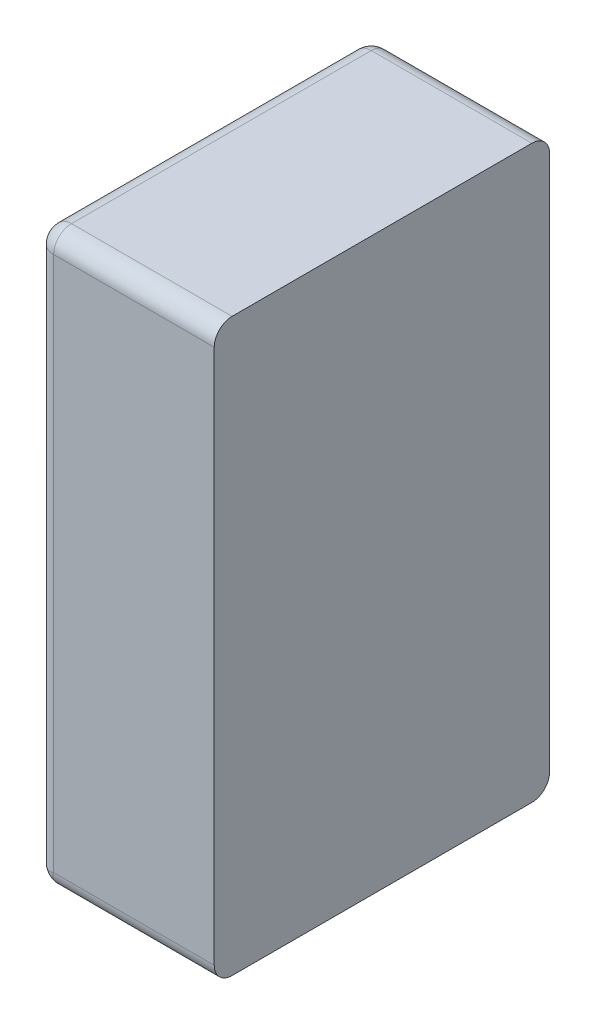
ISO-10303-21;
HEADER;
FILE_DESCRIPTION(('STEP AP214'),'2;1');
FILE_NAME('part.step','',(''),(''),'','','');
FILE_SCHEMA(('AUTOMOTIVE_DESIGN { 1 0 10303 214 1 1 1 1 }'));
ENDSEC;
DATA;
#1=APPLICATION_CONTEXT('core data for automotive mechanical design processes');
#2=APPLICATION_PROTOCOL_DEFINITION('international standard','automotive_design',2000,#1);
#3=PRODUCT_CONTEXT('',#1,'mechanical');
#4=PRODUCT('Part','Part','',(#3));
#5=PRODUCT_RELATED_PRODUCT_CATEGORY('part','',(#4));
#6=PRODUCT_DEFINITION_FORMATION('','',#4);
#7=PRODUCT_DEFINITION_CONTEXT('part definition',#1,'design');
#8=PRODUCT_DEFINITION('design','',#6,#7);
#9=PRODUCT_DEFINITION_SHAPE('','',#8);
#10=(LENGTH_UNIT() NAMED_UNIT(*) SI_UNIT(.MILLI.,.METRE.));
#11=(NAMED_UNIT(*) PLANE_ANGLE_UNIT() SI_UNIT($,.RADIAN.));
#12=(NAMED_UNIT(*) SI_UNIT($,.STERADIAN.) SOLID_ANGLE_UNIT());
#13=UNCERTAINTY_MEASURE_WITH_UNIT(LENGTH_MEASURE(1.E-05),#10,'distance_accuracy_value','');
#14=(GEOMETRIC_REPRESENTATION_CONTEXT(3) GLOBAL_UNCERTAINTY_ASSIGNED_CONTEXT((#13)) GLOBAL_UNIT_ASSIGNED_CONTEXT((#10,
#11,#12)) REPRESENTATION_CONTEXT('',''));
#15=CARTESIAN_POINT('',(0.,0.,0.));
#16=DIRECTION('',(0.,0.,1.));
#17=DIRECTION('',(1.,0.,0.));
#18=AXIS2_PLACEMENT_3D('',#15,#16,#17);
#19=CARTESIAN_POINT('',(-1.55,0.75,0.05));
#20=DIRECTION('',(-0.816496580927727,-0.408248290463863,0.408248290463862));
#21=DIRECTION('',(-0.577350269189625,0.577350269189627,-0.577350269189626));
#22=AXIS2_PLACEMENT_3D('',#19,#20,#21);
#23=SPHERICAL_SURFACE('',#22,0.05);
#24=CARTESIAN_POINT('',(-1.55,0.75,0.05));
#25=DIRECTION('',(0.,0.,-1.));
#26=DIRECTION('',(0.,1.,0.));
#27=AXIS2_PLACEMENT_3D('',#24,#25,#26);
#28=CIRCLE('',#27,0.05);
#29=CARTESIAN_POINT('',(-1.6,0.75,0.05));
#30=VERTEX_POINT('',#29);
#31=CARTESIAN_POINT('',(-1.55,0.8,0.05));
#32=VERTEX_POINT('',#31);
#33=EDGE_CURVE('E11',#30,#32,#28,.T.);
#34=ORIENTED_EDGE('',*,*,#33,.T.);
#35=CARTESIAN_POINT('',(-1.55,0.75,0.05));
#36=DIRECTION('',(-1.,0.,0.));
#37=DIRECTION('',(0.,0.,-1.));
#38=AXIS2_PLACEMENT_3D('',#35,#36,#37);
#39=CIRCLE('',#38,0.05);
#40=CARTESIAN_POINT('',(-1.55,0.75,0.));
#41=VERTEX_POINT('',#40);
#42=EDGE_CURVE('E24',#32,#41,#39,.T.);
#43=ORIENTED_EDGE('',*,*,#42,.T.);
#44=CARTESIAN_POINT('',(-1.55,0.75,0.05));
#45=DIRECTION('',(0.,1.,0.));
#46=DIRECTION('',(-1.,0.,0.));
#47=AXIS2_PLACEMENT_3D('',#44,#45,#46);
#48=CIRCLE('',#47,0.05);
#49=EDGE_CURVE('E237',#41,#30,#48,.T.);
#50=ORIENTED_EDGE('',*,*,#49,.T.);
#51=EDGE_LOOP('',(#34,#43,#50));
#52=FACE_BOUND('',#51,.T.);
#53=ADVANCED_FACE('F17',(#52),#23,.T.);
#54=CARTESIAN_POINT('',(0.799999999999998,0.75,0.05));
#55=DIRECTION('',(-1.,0.,0.));
#56=DIRECTION('',(0.,0.707106781186548,-0.707106781186547));
#57=AXIS2_PLACEMENT_3D('',#54,#55,#56);
#58=CYLINDRICAL_SURFACE('',#57,0.05);
#59=CARTESIAN_POINT('',(-1.1,0.75,0.05));
#60=DIRECTION('',(-1.,0.,0.));
#61=DIRECTION('',(0.,0.707106781186548,-0.707106781186547));
#62=AXIS2_PLACEMENT_3D('',#59,#60,#61);
#63=CIRCLE('',#62,0.05);
#64=CARTESIAN_POINT('',(-1.1,0.8,0.05));
#65=VERTEX_POINT('',#64);
#66=CARTESIAN_POINT('',(-1.1,0.75,0.));
#67=VERTEX_POINT('',#66);
#68=EDGE_CURVE('E230',#65,#67,#63,.T.);
#69=ORIENTED_EDGE('',*,*,#68,.T.);
#70=DIRECTION('',(-1.,0.,0.));
#71=VECTOR('',#70,1.);
#72=CARTESIAN_POINT('',(0.799999999999998,0.75,0.));
#73=LINE('',#72,#71);
#74=EDGE_CURVE('E232',#67,#41,#73,.T.);
#75=ORIENTED_EDGE('',*,*,#74,.T.);
#76=ORIENTED_EDGE('',*,*,#42,.F.);
#77=DIRECTION('',(1.,0.,0.));
#78=VECTOR('',#77,1.);
#79=CARTESIAN_POINT('',(0.799999999999998,0.8,0.05));
#80=LINE('',#79,#78);
#81=EDGE_CURVE('E235',#32,#65,#80,.T.);
#82=ORIENTED_EDGE('',*,*,#81,.T.);
#83=EDGE_LOOP('',(#69,#75,#76,#82));
#84=FACE_BOUND('',#83,.T.);
#85=ADVANCED_FACE('F220',(#84),#58,.T.);
#86=CARTESIAN_POINT('',(-1.55,0.75,0.89));
#87=DIRECTION('',(-0.408248290463864,-0.816496580927725,0.408248290463864));
#88=DIRECTION('',(-0.577350269189625,0.577350269189627,0.577350269189625));
#89=AXIS2_PLACEMENT_3D('',#86,#87,#88);
#90=SPHERICAL_SURFACE('',#89,0.05);
#91=CARTESIAN_POINT('',(-1.55,0.75,0.89));
#92=DIRECTION('',(-1.,0.,0.));
#93=DIRECTION('',(0.,1.,0.));
#94=AXIS2_PLACEMENT_3D('',#91,#92,#93);
#95=CIRCLE('',#94,0.05);
#96=CARTESIAN_POINT('',(-1.55,0.75,0.94));
#97=VERTEX_POINT('',#96);
#98=CARTESIAN_POINT('',(-1.55,0.8,0.89));
#99=VERTEX_POINT('',#98);
#100=EDGE_CURVE('E106',#97,#99,#95,.T.);
#101=ORIENTED_EDGE('',*,*,#100,.T.);
#102=CARTESIAN_POINT('',(-1.55,0.75,0.89));
#103=DIRECTION('',(0.,0.,1.));
#104=DIRECTION('',(-1.,0.,0.));
#105=AXIS2_PLACEMENT_3D('',#102,#103,#104);
#106=CIRCLE('',#105,0.05);
#107=CARTESIAN_POINT('',(-1.6,0.75,0.89));
#108=VERTEX_POINT('',#107);
#109=EDGE_CURVE('E285',#99,#108,#106,.T.);
#110=ORIENTED_EDGE('',*,*,#109,.T.);
#111=CARTESIAN_POINT('',(-1.55,0.75,0.89));
#112=DIRECTION('',(0.,1.,0.));
#113=DIRECTION('',(0.,0.,1.));
#114=AXIS2_PLACEMENT_3D('',#111,#112,#113);
#115=CIRCLE('',#114,0.05);
#116=EDGE_CURVE('E281',#108,#97,#115,.T.);
#117=ORIENTED_EDGE('',*,*,#116,.T.);
#118=EDGE_LOOP('',(#101,#110,#117));
#119=FACE_BOUND('',#118,.T.);
#120=ADVANCED_FACE('F218',(#119),#90,.T.);
#121=CARTESIAN_POINT('',(-1.55,0.75,0.));
#122=DIRECTION('',(0.,0.,1.));
#123=DIRECTION('',(-0.707106781186548,0.707106781186548,0.));
#124=AXIS2_PLACEMENT_3D('',#121,#122,#123);
#125=CYLINDRICAL_SURFACE('',#124,0.05);
#126=ORIENTED_EDGE('',*,*,#109,.F.);
#127=DIRECTION('',(0.,0.,-1.));
#128=VECTOR('',#127,1.);
#129=CARTESIAN_POINT('',(-1.55,0.8,0.));
#130=LINE('',#129,#128);
#131=EDGE_CURVE('E277',#99,#32,#130,.T.);
#132=ORIENTED_EDGE('',*,*,#131,.T.);
#133=ORIENTED_EDGE('',*,*,#33,.F.);
#134=DIRECTION('',(0.,0.,1.));
#135=VECTOR('',#134,1.);
#136=CARTESIAN_POINT('',(-1.6,0.75,0.));
#137=LINE('',#136,#135);
#138=EDGE_CURVE('E276',#30,#108,#137,.T.);
#139=ORIENTED_EDGE('',*,*,#138,.T.);
#140=EDGE_LOOP('',(#126,#132,#133,#139));
#141=FACE_BOUND('',#140,.T.);
#142=ADVANCED_FACE('F214',(#141),#125,.T.);
#143=CARTESIAN_POINT('',(-1.55,-0.75,0.05));
#144=DIRECTION('',(-0.816496580927728,0.408248290463862,0.408248290463861));
#145=DIRECTION('',(-0.577350269189623,-0.577350269189627,-0.577350269189627));
#146=AXIS2_PLACEMENT_3D('',#143,#144,#145);
#147=SPHERICAL_SURFACE('',#146,0.05);
#148=CARTESIAN_POINT('',(-1.55,-0.8,0.05));
#149=CARTESIAN_POINT('',(-1.55083135242767,-0.800000020313967,0.0499435233591183));
#150=CARTESIAN_POINT('',(-1.55166211112483,-0.799979171317549,0.0498788316884434));
#151=CARTESIAN_POINT('',(-1.55332402424875,-0.799895695565037,0.0497346088043771));
#152=CARTESIAN_POINT('',(-1.55415516357154,-0.799832880868058,0.0496550119985609));
#153=CARTESIAN_POINT('',(-1.55581523610608,-0.799665097579262,0.0494827653283566));
#154=CARTESIAN_POINT('',(-1.55664414679495,-0.799559959502558,0.0493900639666642));
#155=CARTESIAN_POINT('',(-1.55829721664536,-0.799307372398355,0.0491934791832936));
#156=CARTESIAN_POINT('',(-1.55912134835722,-0.799159773963409,0.0490895570997497));
#157=CARTESIAN_POINT('',(-1.56076234724915,-0.798822292392348,0.0488724712471381));
#158=CARTESIAN_POINT('',(-1.56157918442682,-0.798632281058567,0.0487592801323912));
#159=CARTESIAN_POINT('',(-1.56320313201674,-0.798210195281024,0.0485256558233741));
#160=CARTESIAN_POINT('',(-1.56401021227114,-0.797978014684369,0.0484052048771467));
#161=CARTESIAN_POINT('',(-1.56561224116745,-0.797472005262752,0.0481591078044245));
#162=CARTESIAN_POINT('',(-1.56640716184318,-0.797198092814036,0.0480334516240748));
#163=CARTESIAN_POINT('',(-1.56798253353389,-0.796609228401466,0.0477790264509254));
#164=CARTESIAN_POINT('',(-1.56876296105217,-0.79629421548598,0.0476502530710441));
#165=CARTESIAN_POINT('',(-1.5703070834178,-0.79562395131688,0.0473916991891467));
#166=CARTESIAN_POINT('',(-1.57107076141787,-0.795268661584212,0.0472619178362775));
#167=CARTESIAN_POINT('',(-1.57257920486178,-0.794518835357465,0.0470034647516007));
#168=CARTESIAN_POINT('',(-1.5733239621661,-0.794124282319878,0.0468747935125627));
#169=CARTESIAN_POINT('',(-1.57479247507204,-0.793297108379355,0.0466206760870282));
#170=CARTESIAN_POINT('',(-1.57551623315645,-0.792864492001337,0.046495229519472));
#171=CARTESIAN_POINT('',(-1.57694075639946,-0.791962553597264,0.0462496631718509));
#172=CARTESIAN_POINT('',(-1.57764153641367,-0.791493255977843,0.0461295399317951));
#173=CARTESIAN_POINT('',(-1.5790182169205,-0.790519495705679,0.0458966959351089));
#174=CARTESIAN_POINT('',(-1.57969414620938,-0.790015075848481,0.0457839664838229));
#175=CARTESIAN_POINT('',(-1.58101934949802,-0.788972784289588,0.0455679474870254));
#176=CARTESIAN_POINT('',(-1.58166866760279,-0.788434971990044,0.0454646419425221));
#177=CARTESIAN_POINT('',(-1.58293898925504,-0.787327774609329,0.0452694578455206));
#178=CARTESIAN_POINT('',(-1.58356005336898,-0.786758463484926,0.0451775540422923));
#179=CARTESIAN_POINT('',(-1.5847723293902,-0.785590305843476,0.0450070983509291));
#180=CARTESIAN_POINT('',(-1.5853636192483,-0.78499154553938,0.0449285101707249));
#181=CARTESIAN_POINT('',(-1.58651493527515,-0.783766676890247,0.0447865369560409));
#182=CARTESIAN_POINT('',(-1.58707505745919,-0.783140664496341,0.0447231029909742));
#183=CARTESIAN_POINT('',(-1.58816275678178,-0.781863619839021,0.0446132045740466));
#184=CARTESIAN_POINT('',(-1.58869044842568,-0.781212690558093,0.0445666771817416));
#185=CARTESIAN_POINT('',(-1.58971213879615,-0.779888271236327,0.0444922626613215));
#186=CARTESIAN_POINT('',(-1.59020627067896,-0.779214888348585,0.04446429746925));
#187=CARTESIAN_POINT('',(-1.59115982988534,-0.777848141278855,0.0444285722064917));
#188=CARTESIAN_POINT('',(-1.59161940890336,-0.777154885445235,0.0444207181221763));
#189=CARTESIAN_POINT('',(-1.59250298909048,-0.775751081087255,0.0444266642867391));
#190=CARTESIAN_POINT('',(-1.59292716009926,-0.775040639060477,0.0444403540608964));
#191=CARTESIAN_POINT('',(-1.59373919083561,-0.773605248184243,0.0444907123562373));
#192=CARTESIAN_POINT('',(-1.59412723787,-0.772880400913832,0.0445272537688011));
#193=CARTESIAN_POINT('',(-1.59486642792602,-0.771419070457526,0.0446245063781686));
#194=CARTESIAN_POINT('',(-1.59521777475648,-0.770682680895238,0.0446850740184744));
#195=CARTESIAN_POINT('',(-1.5958831127108,-0.769201208347947,0.0448314290670078));
#196=CARTESIAN_POINT('',(-1.59619732289344,-0.768456208087868,0.0449170570292829));
#197=CARTESIAN_POINT('',(-1.59678807615493,-0.766960517038454,0.045114433887425));
#198=CARTESIAN_POINT('',(-1.59706485201088,-0.766209895271862,0.0452260083926238));
#199=CARTESIAN_POINT('',(-1.59758056582694,-0.764706002926951,0.0454760267006072));
#200=CARTESIAN_POINT('',(-1.59781974846915,-0.763952785138196,0.0456142824809018));
#201=CARTESIAN_POINT('',(-1.59826023919175,-0.762446796385434,0.0459182446015831));
#202=CARTESIAN_POINT('',(-1.59846180182021,-0.761694059537445,0.0460837510376663));
#203=CARTESIAN_POINT('',(-1.59882716569432,-0.760192060427522,0.0464426562736405));
#204=CARTESIAN_POINT('',(-1.5989912289485,-0.759442812292273,0.0466358451686541));
#205=CARTESIAN_POINT('',(-1.59920955873537,-0.758321945507501,0.0469472676303907));
#206=CARTESIAN_POINT('',(-1.59927756015494,-0.757949832604319,0.0470543611182232));
#207=CARTESIAN_POINT('',(-1.5994042588909,-0.757207637428366,0.0472755688333026));
#208=CARTESIAN_POINT('',(-1.59946298976778,-0.756837552741953,0.0473896555588764));
#209=CARTESIAN_POINT('',(-1.59957119336077,-0.756099812695661,0.0476248505186726));
#210=CARTESIAN_POINT('',(-1.59962069975311,-0.755732153421865,0.047745931010722));
#211=CARTESIAN_POINT('',(-1.5997105129861,-0.754999641822439,0.0479951079959894));
#212=CARTESIAN_POINT('',(-1.59975085351182,-0.754634784141684,0.0481231765815452));
#213=CARTESIAN_POINT('',(-1.59982239989622,-0.753908256305697,0.0483863123143096));
#214=CARTESIAN_POINT('',(-1.59985363936352,-0.753546579332125,0.0485213514872187));
#215=CARTESIAN_POINT('',(-1.59990705649925,-0.75282678964261,0.0487984002102192));
#216=CARTESIAN_POINT('',(-1.59992926760641,-0.752468668656838,0.0489403818161762));
#217=CARTESIAN_POINT('',(-1.59996470752091,-0.751756364451594,0.0492312772281742));
#218=CARTESIAN_POINT('',(-1.59997796950743,-0.751402171529021,0.0493801632160354));
#219=CARTESIAN_POINT('',(-1.59999560007552,-0.750698095332166,0.0496848150261171));
#220=CARTESIAN_POINT('',(-1.6000000014759,-0.750348200942932,0.0498405532686796));
#221=CARTESIAN_POINT('',(-1.6,-0.75,0.05));
#222=B_SPLINE_CURVE_WITH_KNOTS('',3,(#148,#149,#150,#151,#152,#153,#154,#155,#156,#157,#158,
#159,#160,#161,#162,#163,#164,#165,#166,#167,#168,#169,#170,#171,#172,#173,#174,#175,#176,#177,
#178,#179,#180,#181,#182,#183,#184,#185,#186,#187,#188,#189,#190,#191,#192,#193,#194,#195,#196,
#197,#198,#199,#200,#201,#202,#203,#204,#205,#206,#207,#208,#209,#210,#211,#212,#213,#214,#215,
#216,#217,#218,#219,#220,#221),.UNSPECIFIED.,.F.,.F.,(4,2,2,2,2,2,2,2,2,2,2,2,2,2,2,2,2,2,2,2,2,
2,2,2,2,2,2,2,2,2,2,2,2,2,2,2,4),(0.,0.00249945349828864,0.00501017636236185,
0.00753105510997417,0.0100609150362242,0.0125985278601289,0.0151426194708621,0.017691877752768,
0.0202449604712911,0.0228005032044077,0.0253571273060391,0.0279134478892869,0.0304680818182009,
0.0330196556971655,0.0355668138468769,0.0381082262553105,0.0406425964909796,0.0431686695642028,
0.0456852397199664,0.0481911581432671,0.050685340554528,0.0531667746687544,0.0556345274875088,
0.0580877523875285,0.0605256959638785,0.0629477045789644,0.0653532305615734,0.0677418379925143,
0.0701132080055177,0.0712924926926686,0.0724674051483097,0.0736379404537152,0.0748041017706804,
0.0759659004268235,0.0771233559869031,0.0782764963093342,0.0794253575870824),.UNSPECIFIED.);
#223=CARTESIAN_POINT('',(-1.55,-0.8,0.05));
#224=VERTEX_POINT('',#223);
#225=CARTESIAN_POINT('',(-1.6,-0.75,0.05));
#226=VERTEX_POINT('',#225);
#227=EDGE_CURVE('E196',#224,#226,#222,.T.);
#228=ORIENTED_EDGE('',*,*,#227,.T.);
#229=CARTESIAN_POINT('',(-1.55,-0.75,0.05));
#230=DIRECTION('',(0.,-1.,0.));
#231=DIRECTION('',(0.,0.,-1.));
#232=AXIS2_PLACEMENT_3D('',#229,#230,#231);
#233=CIRCLE('',#232,0.05);
#234=CARTESIAN_POINT('',(-1.55,-0.75,0.));
#235=VERTEX_POINT('',#234);
#236=EDGE_CURVE('E188',#226,#235,#233,.T.);
#237=ORIENTED_EDGE('',*,*,#236,.T.);
#238=CARTESIAN_POINT('',(-1.55,-0.75,0.05));
#239=DIRECTION('',(-1.,0.,0.));
#240=DIRECTION('',(0.,-1.,0.));
#241=AXIS2_PLACEMENT_3D('',#238,#239,#240);
#242=CIRCLE('',#241,0.05);
#243=EDGE_CURVE('E256',#235,#224,#242,.T.);
#244=ORIENTED_EDGE('',*,*,#243,.T.);
#245=EDGE_LOOP('',(#228,#237,#244));
#246=FACE_BOUND('',#245,.T.);
#247=ADVANCED_FACE('F203',(#246),#147,.T.);
#248=CARTESIAN_POINT('',(-1.55,0.4,0.05));
#249=DIRECTION('',(0.,-1.,0.));
#250=DIRECTION('',(-0.707106781186548,0.,-0.707106781186547));
#251=AXIS2_PLACEMENT_3D('',#248,#249,#250);
#252=CYLINDRICAL_SURFACE('',#251,0.05);
#253=ORIENTED_EDGE('',*,*,#236,.F.);
#254=DIRECTION('',(0.,1.,0.));
#255=VECTOR('',#254,1.);
#256=CARTESIAN_POINT('',(-1.6,0.4,0.05));
#257=LINE('',#256,#255);
#258=EDGE_CURVE('E267',#226,#30,#257,.T.);
#259=ORIENTED_EDGE('',*,*,#258,.T.);
#260=ORIENTED_EDGE('',*,*,#49,.F.);
#261=DIRECTION('',(0.,-1.,0.));
#262=VECTOR('',#261,1.);
#263=CARTESIAN_POINT('',(-1.55,0.4,0.));
#264=LINE('',#263,#262);
#265=EDGE_CURVE('E243',#41,#235,#264,.T.);
#266=ORIENTED_EDGE('',*,*,#265,.T.);
#267=EDGE_LOOP('',(#253,#259,#260,#266));
#268=FACE_BOUND('',#267,.T.);
#269=ADVANCED_FACE('F213',(#268),#252,.T.);
#270=CARTESIAN_POINT('',(-0.800000000000002,-0.75,0.05));
#271=DIRECTION('',(1.,0.,0.));
#272=DIRECTION('',(0.,-0.707106781186548,-0.707106781186547));
#273=AXIS2_PLACEMENT_3D('',#270,#271,#272);
#274=CYLINDRICAL_SURFACE('',#273,0.05);
#275=CARTESIAN_POINT('',(-1.1,-0.75,0.05));
#276=DIRECTION('',(-1.,0.,0.));
#277=DIRECTION('',(0.,-0.707106781186548,-0.707106781186547));
#278=AXIS2_PLACEMENT_3D('',#275,#276,#277);
#279=CIRCLE('',#278,0.05);
#280=CARTESIAN_POINT('',(-1.1,-0.75,0.));
#281=VERTEX_POINT('',#280);
#282=CARTESIAN_POINT('',(-1.1,-0.8,0.05));
#283=VERTEX_POINT('',#282);
#284=EDGE_CURVE('E246',#281,#283,#279,.T.);
#285=ORIENTED_EDGE('',*,*,#284,.T.);
#286=DIRECTION('',(-1.,0.,0.));
#287=VECTOR('',#286,1.);
#288=CARTESIAN_POINT('',(-0.800000000000002,-0.8,0.05));
#289=LINE('',#288,#287);
#290=EDGE_CURVE('E251',#283,#224,#289,.T.);
#291=ORIENTED_EDGE('',*,*,#290,.T.);
#292=ORIENTED_EDGE('',*,*,#243,.F.);
#293=DIRECTION('',(1.,0.,0.));
#294=VECTOR('',#293,1.);
#295=CARTESIAN_POINT('',(-0.800000000000002,-0.75,0.));
#296=LINE('',#295,#294);
#297=EDGE_CURVE('E254',#235,#281,#296,.T.);
#298=ORIENTED_EDGE('',*,*,#297,.T.);
#299=EDGE_LOOP('',(#285,#291,#292,#298));
#300=FACE_BOUND('',#299,.T.);
#301=ADVANCED_FACE('F255',(#300),#274,.T.);
#302=CARTESIAN_POINT('',(-1.55,-0.75,0.89));
#303=DIRECTION('',(-0.408248290463863,-0.408248290463861,-0.816496580927727));
#304=DIRECTION('',(-0.577350269189628,-0.577350269189625,0.577350269189624));
#305=AXIS2_PLACEMENT_3D('',#302,#303,#304);
#306=SPHERICAL_SURFACE('',#305,0.05);
#307=CARTESIAN_POINT('',(-1.55,-0.75,0.94));
#308=CARTESIAN_POINT('',(-1.55034820094293,-0.750159446731321,0.940000001475902));
#309=CARTESIAN_POINT('',(-1.55069809533217,-0.750315184973883,0.939995600075518));
#310=CARTESIAN_POINT('',(-1.55140217152902,-0.750619836783965,0.939977969507428));
#311=CARTESIAN_POINT('',(-1.55175636445159,-0.750768722771826,0.939964707520909));
#312=CARTESIAN_POINT('',(-1.55246866865684,-0.751059618183824,0.93992926760641));
#313=CARTESIAN_POINT('',(-1.55282678964261,-0.751201599789781,0.939907056499251));
#314=CARTESIAN_POINT('',(-1.55354657933213,-0.751478648512781,0.939853639363523));
#315=CARTESIAN_POINT('',(-1.5539082563057,-0.75161368768569,0.939822399896223));
#316=CARTESIAN_POINT('',(-1.55463478414168,-0.751876823418455,0.939750853511815));
#317=CARTESIAN_POINT('',(-1.55499964182244,-0.752004892004011,0.939710512986096));
#318=CARTESIAN_POINT('',(-1.55573215342186,-0.752254068989278,0.939620699753114));
#319=CARTESIAN_POINT('',(-1.55609981269566,-0.752375149481327,0.939571193360768));
#320=CARTESIAN_POINT('',(-1.55683755274195,-0.752610344441124,0.939462989767779));
#321=CARTESIAN_POINT('',(-1.55720763742837,-0.752724431166697,0.9394042588909));
#322=CARTESIAN_POINT('',(-1.55794983260432,-0.752945638881777,0.939277560154943));
#323=CARTESIAN_POINT('',(-1.5583219455075,-0.753052732369609,0.93920955873537));
#324=CARTESIAN_POINT('',(-1.55944281229227,-0.753364154831346,0.938991228948502));
#325=CARTESIAN_POINT('',(-1.56019206042752,-0.75355734372636,0.938827165694317));
#326=CARTESIAN_POINT('',(-1.56169405953744,-0.753916248962334,0.938461801820209));
#327=CARTESIAN_POINT('',(-1.56244679638543,-0.754081755398417,0.938260239191747));
#328=CARTESIAN_POINT('',(-1.5639527851382,-0.754385717519098,0.93781974846915));
#329=CARTESIAN_POINT('',(-1.56470600292695,-0.754523973299393,0.937580565826942));
#330=CARTESIAN_POINT('',(-1.56620989527186,-0.754773991607376,0.937064852010877));
#331=CARTESIAN_POINT('',(-1.56696051703845,-0.754885566112575,0.936788076154931));
#332=CARTESIAN_POINT('',(-1.56845620808787,-0.755082942970717,0.936197322893436));
#333=CARTESIAN_POINT('',(-1.56920120834795,-0.755168570932992,0.935883112710797));
#334=CARTESIAN_POINT('',(-1.57068268089524,-0.755314925981526,0.935217774756478));
#335=CARTESIAN_POINT('',(-1.57141907045753,-0.755375493621831,0.934866427926017));
#336=CARTESIAN_POINT('',(-1.57288040091383,-0.755472746231199,0.934127237870004));
#337=CARTESIAN_POINT('',(-1.57360524818424,-0.755509287643763,0.933739190835606));
#338=CARTESIAN_POINT('',(-1.57504063906048,-0.755559645939104,0.932927160099263));
#339=CARTESIAN_POINT('',(-1.57575108108726,-0.755573335713261,0.932502989090476));
#340=CARTESIAN_POINT('',(-1.57715488544524,-0.755579281877824,0.931619408903357));
#341=CARTESIAN_POINT('',(-1.57784814127885,-0.755571427793508,0.931159829885339));
#342=CARTESIAN_POINT('',(-1.57921488834858,-0.75553570253075,0.930206270678963));
#343=CARTESIAN_POINT('',(-1.57988827123633,-0.755507737338679,0.929712138796154));
#344=CARTESIAN_POINT('',(-1.58121269055809,-0.755433322818258,0.928690448425676));
#345=CARTESIAN_POINT('',(-1.58186361983902,-0.755386795425953,0.928162756781776));
#346=CARTESIAN_POINT('',(-1.58314066449634,-0.755276897009026,0.927075057459189));
#347=CARTESIAN_POINT('',(-1.58376667689025,-0.755213463043959,0.926514935275151));
#348=CARTESIAN_POINT('',(-1.58499154553938,-0.755071489829275,0.9253636192483));
#349=CARTESIAN_POINT('',(-1.58559030584348,-0.754992901649071,0.924772329390201));
#350=CARTESIAN_POINT('',(-1.58675846348493,-0.754822445957708,0.923560053368979));
#351=CARTESIAN_POINT('',(-1.58732777460933,-0.754730542154479,0.922938989255036));
#352=CARTESIAN_POINT('',(-1.58843497199004,-0.754535358057478,0.921668667602786));
#353=CARTESIAN_POINT('',(-1.58897278428959,-0.754432052512975,0.921019349498018));
#354=CARTESIAN_POINT('',(-1.59001507584848,-0.754216033516177,0.919694146209385));
#355=CARTESIAN_POINT('',(-1.59051949570568,-0.754103304064891,0.919018216920503));
#356=CARTESIAN_POINT('',(-1.59149325597784,-0.753870460068205,0.917641536413672));
#357=CARTESIAN_POINT('',(-1.59196255359726,-0.753750336828149,0.916940756399464));
#358=CARTESIAN_POINT('',(-1.59286449200134,-0.753504770480528,0.91551623315645));
#359=CARTESIAN_POINT('',(-1.59329710837936,-0.753379323912972,0.914792475072041));
#360=CARTESIAN_POINT('',(-1.59412428231988,-0.753125206487437,0.913323962166104));
#361=CARTESIAN_POINT('',(-1.59451883535746,-0.752996535248399,0.912579204861783));
#362=CARTESIAN_POINT('',(-1.59526866158421,-0.752738082163723,0.911070761417873));
#363=CARTESIAN_POINT('',(-1.59562395131688,-0.752608300810853,0.910307083417801));
#364=CARTESIAN_POINT('',(-1.59629421548598,-0.752349746928956,0.90876296105217));
#365=CARTESIAN_POINT('',(-1.59660922840147,-0.752220973549075,0.907982533533888));
#366=CARTESIAN_POINT('',(-1.59719809281404,-0.751966548375925,0.906407161843179));
#367=CARTESIAN_POINT('',(-1.59747200526275,-0.751840892195576,0.905612241167447));
#368=CARTESIAN_POINT('',(-1.59797801468437,-0.751594795122853,0.904010212271137));
#369=CARTESIAN_POINT('',(-1.59821019528102,-0.751474344176626,0.903203132016743));
#370=CARTESIAN_POINT('',(-1.59863228105857,-0.751240719867609,0.901579184426824));
#371=CARTESIAN_POINT('',(-1.59882229239235,-0.751127528752862,0.900762347249152));
#372=CARTESIAN_POINT('',(-1.59915977396341,-0.75091044290025,0.89912134835722));
#373=CARTESIAN_POINT('',(-1.59930737239836,-0.750806520816707,0.898297216645363));
#374=CARTESIAN_POINT('',(-1.59955995950256,-0.750609936033336,0.896644146794953));
#375=CARTESIAN_POINT('',(-1.59966509757926,-0.750517234671643,0.895815236106076));
#376=CARTESIAN_POINT('',(-1.59983288086806,-0.750344988001439,0.894155163571538));
#377=CARTESIAN_POINT('',(-1.59989569556504,-0.750265391195623,0.893324024248752));
#378=CARTESIAN_POINT('',(-1.59997917131755,-0.750121168311557,0.891662111124828));
#379=CARTESIAN_POINT('',(-1.60000002031397,-0.750056476640882,0.890831352427667));
#380=CARTESIAN_POINT('',(-1.6,-0.75,0.89));
#381=B_SPLINE_CURVE_WITH_KNOTS('',3,(#307,#308,#309,#310,#311,#312,#313,#314,#315,#316,#317,
#318,#319,#320,#321,#322,#323,#324,#325,#326,#327,#328,#329,#330,#331,#332,#333,#334,#335,#336,
#337,#338,#339,#340,#341,#342,#343,#344,#345,#346,#347,#348,#349,#350,#351,#352,#353,#354,#355,
#356,#357,#358,#359,#360,#361,#362,#363,#364,#365,#366,#367,#368,#369,#370,#371,#372,#373,#374,
#375,#376,#377,#378,#379,#380),.UNSPECIFIED.,.F.,.F.,(4,2,2,2,2,2,2,2,2,2,2,2,2,2,2,2,2,2,2,2,2,
2,2,2,2,2,2,2,2,2,2,2,2,2,2,2,4),(0.,0.0011488612777482,0.00230200160017947,0.00345945716025894,
0.00462125581640211,0.00578741713336717,0.0069579524387729,0.00813286489441382,
0.00931214958156482,0.0116835195945682,0.014072127025509,0.0164776530081182,0.018899661623204,
0.021337605199554,0.0237908300995736,0.0262585829183281,0.0287400170325545,0.0312341994438154,
0.0337401178671161,0.0362566880228797,0.038782761096103,0.0413171313317719,0.0438585437402055,
0.0464057018899171,0.0489572757688815,0.0515119096977956,0.0540682302810433,0.0566248543826747,
0.0591803971157914,0.0617334798343144,0.0642827381162203,0.0668268297269536,0.0693644425508582,
0.0718943024771082,0.0744151812247207,0.0769259040887937,0.0794253575870823),.UNSPECIFIED.);
#382=CARTESIAN_POINT('',(-1.55,-0.75,0.94));
#383=VERTEX_POINT('',#382);
#384=CARTESIAN_POINT('',(-1.6,-0.75,0.89));
#385=VERTEX_POINT('',#384);
#386=EDGE_CURVE('E257',#383,#385,#381,.T.);
#387=ORIENTED_EDGE('',*,*,#386,.T.);
#388=CARTESIAN_POINT('',(-1.55,-0.75,0.89));
#389=DIRECTION('',(0.,0.,1.));
#390=DIRECTION('',(0.,-1.,0.));
#391=AXIS2_PLACEMENT_3D('',#388,#389,#390);
#392=CIRCLE('',#391,0.05);
#393=CARTESIAN_POINT('',(-1.55,-0.8,0.89));
#394=VERTEX_POINT('',#393);
#395=EDGE_CURVE('E260',#385,#394,#392,.T.);
#396=ORIENTED_EDGE('',*,*,#395,.T.);
#397=CARTESIAN_POINT('',(-1.55,-0.8,0.89));
#398=CARTESIAN_POINT('',(-1.55005647664088,-0.800000020313967,0.890831352427667));
#399=CARTESIAN_POINT('',(-1.55012116831156,-0.799979171317549,0.891662111124828));
#400=CARTESIAN_POINT('',(-1.55026539119562,-0.799895695565037,0.893324024248752));
#401=CARTESIAN_POINT('',(-1.55034498800144,-0.799832880868058,0.894155163571538));
#402=CARTESIAN_POINT('',(-1.55051723467164,-0.799665097579262,0.895815236106077));
#403=CARTESIAN_POINT('',(-1.55060993603334,-0.799559959502558,0.896644146794953));
#404=CARTESIAN_POINT('',(-1.55080652081671,-0.799307372398355,0.898297216645363));
#405=CARTESIAN_POINT('',(-1.55091044290025,-0.799159773963409,0.899121348357221));
#406=CARTESIAN_POINT('',(-1.55112752875286,-0.798822292392348,0.900762347249152));
#407=CARTESIAN_POINT('',(-1.55124071986761,-0.798632281058567,0.901579184426824));
#408=CARTESIAN_POINT('',(-1.55147434417663,-0.798210195281024,0.903203132016743));
#409=CARTESIAN_POINT('',(-1.55159479512285,-0.797978014684369,0.904010212271137));
#410=CARTESIAN_POINT('',(-1.55184089219558,-0.797472005262752,0.905612241167447));
#411=CARTESIAN_POINT('',(-1.55196654837593,-0.797198092814035,0.906407161843179));
#412=CARTESIAN_POINT('',(-1.55222097354907,-0.796609228401466,0.907982533533888));
#413=CARTESIAN_POINT('',(-1.55234974692896,-0.79629421548598,0.90876296105217));
#414=CARTESIAN_POINT('',(-1.55260830081085,-0.79562395131688,0.910307083417801));
#415=CARTESIAN_POINT('',(-1.55273808216372,-0.795268661584212,0.911070761417873));
#416=CARTESIAN_POINT('',(-1.5529965352484,-0.794518835357465,0.912579204861783));
#417=CARTESIAN_POINT('',(-1.55312520648744,-0.794124282319878,0.913323962166104));
#418=CARTESIAN_POINT('',(-1.55337932391297,-0.793297108379355,0.914792475072041));
#419=CARTESIAN_POINT('',(-1.55350477048053,-0.792864492001337,0.91551623315645));
#420=CARTESIAN_POINT('',(-1.55375033682815,-0.791962553597264,0.916940756399464));
#421=CARTESIAN_POINT('',(-1.5538704600682,-0.791493255977843,0.917641536413672));
#422=CARTESIAN_POINT('',(-1.55410330406489,-0.790519495705679,0.919018216920503));
#423=CARTESIAN_POINT('',(-1.55421603351618,-0.790015075848481,0.919694146209385));
#424=CARTESIAN_POINT('',(-1.55443205251297,-0.788972784289588,0.921019349498018));
#425=CARTESIAN_POINT('',(-1.55453535805748,-0.788434971990044,0.921668667602786));
#426=CARTESIAN_POINT('',(-1.55473054215448,-0.787327774609329,0.922938989255036));
#427=CARTESIAN_POINT('',(-1.55482244595771,-0.786758463484927,0.923560053368979));
#428=CARTESIAN_POINT('',(-1.55499290164907,-0.785590305843476,0.924772329390201));
#429=CARTESIAN_POINT('',(-1.55507148982928,-0.78499154553938,0.9253636192483));
#430=CARTESIAN_POINT('',(-1.55521346304396,-0.783766676890247,0.926514935275151));
#431=CARTESIAN_POINT('',(-1.55527689700903,-0.783140664496341,0.927075057459189));
#432=CARTESIAN_POINT('',(-1.55538679542595,-0.781863619839021,0.928162756781776));
#433=CARTESIAN_POINT('',(-1.55543332281826,-0.781212690558093,0.928690448425676));
#434=CARTESIAN_POINT('',(-1.55550773733868,-0.779888271236327,0.929712138796154));
#435=CARTESIAN_POINT('',(-1.55553570253075,-0.779214888348585,0.930206270678963));
#436=CARTESIAN_POINT('',(-1.55557142779351,-0.777848141278855,0.931159829885339));
#437=CARTESIAN_POINT('',(-1.55557928187782,-0.777154885445235,0.931619408903357));
#438=CARTESIAN_POINT('',(-1.55557333571326,-0.775751081087255,0.932502989090476));
#439=CARTESIAN_POINT('',(-1.5555596459391,-0.775040639060477,0.932927160099263));
#440=CARTESIAN_POINT('',(-1.55550928764376,-0.773605248184243,0.933739190835606));
#441=CARTESIAN_POINT('',(-1.5554727462312,-0.772880400913832,0.934127237870004));
#442=CARTESIAN_POINT('',(-1.55537549362183,-0.771419070457526,0.934866427926017));
#443=CARTESIAN_POINT('',(-1.55531492598153,-0.770682680895238,0.935217774756478));
#444=CARTESIAN_POINT('',(-1.55516857093299,-0.769201208347948,0.935883112710797));
#445=CARTESIAN_POINT('',(-1.55508294297072,-0.768456208087868,0.936197322893436));
#446=CARTESIAN_POINT('',(-1.55488556611257,-0.766960517038454,0.936788076154931));
#447=CARTESIAN_POINT('',(-1.55477399160738,-0.766209895271862,0.937064852010877));
#448=CARTESIAN_POINT('',(-1.55452397329939,-0.764706002926951,0.937580565826942));
#449=CARTESIAN_POINT('',(-1.5543857175191,-0.763952785138196,0.93781974846915));
#450=CARTESIAN_POINT('',(-1.55408175539842,-0.762446796385434,0.938260239191747));
#451=CARTESIAN_POINT('',(-1.55391624896233,-0.761694059537445,0.938461801820209));
#452=CARTESIAN_POINT('',(-1.55355734372636,-0.760192060427522,0.938827165694317));
#453=CARTESIAN_POINT('',(-1.55336415483135,-0.759442812292273,0.938991228948502));
#454=CARTESIAN_POINT('',(-1.55305273236961,-0.758321945507501,0.93920955873537));
#455=CARTESIAN_POINT('',(-1.55294563888178,-0.757949832604319,0.939277560154943));
#456=CARTESIAN_POINT('',(-1.5527244311667,-0.757207637428366,0.9394042588909));
#457=CARTESIAN_POINT('',(-1.55261034444112,-0.756837552741953,0.939462989767779));
#458=CARTESIAN_POINT('',(-1.55237514948133,-0.756099812695661,0.939571193360768));
#459=CARTESIAN_POINT('',(-1.55225406898928,-0.755732153421865,0.939620699753114));
#460=CARTESIAN_POINT('',(-1.55200489200401,-0.754999641822439,0.939710512986096));
#461=CARTESIAN_POINT('',(-1.55187682341845,-0.754634784141684,0.939750853511815));
#462=CARTESIAN_POINT('',(-1.55161368768569,-0.753908256305697,0.939822399896223));
#463=CARTESIAN_POINT('',(-1.55147864851278,-0.753546579332125,0.939853639363523));
#464=CARTESIAN_POINT('',(-1.55120159978978,-0.75282678964261,0.939907056499251));
#465=CARTESIAN_POINT('',(-1.55105961818382,-0.752468668656838,0.93992926760641));
#466=CARTESIAN_POINT('',(-1.55076872277183,-0.751756364451594,0.939964707520909));
#467=CARTESIAN_POINT('',(-1.55061983678396,-0.751402171529021,0.939977969507428));
#468=CARTESIAN_POINT('',(-1.55031518497388,-0.750698095332166,0.939995600075518));
#469=CARTESIAN_POINT('',(-1.55015944673132,-0.750348200942932,0.940000001475902));
#470=CARTESIAN_POINT('',(-1.55,-0.75,0.94));
#471=B_SPLINE_CURVE_WITH_KNOTS('',3,(#397,#398,#399,#400,#401,#402,#403,#404,#405,#406,#407,
#408,#409,#410,#411,#412,#413,#414,#415,#416,#417,#418,#419,#420,#421,#422,#423,#424,#425,#426,
#427,#428,#429,#430,#431,#432,#433,#434,#435,#436,#437,#438,#439,#440,#441,#442,#443,#444,#445,
#446,#447,#448,#449,#450,#451,#452,#453,#454,#455,#456,#457,#458,#459,#460,#461,#462,#463,#464,
#465,#466,#467,#468,#469,#470),.UNSPECIFIED.,.F.,.F.,(4,2,2,2,2,2,2,2,2,2,2,2,2,2,2,2,2,2,2,2,2,
2,2,2,2,2,2,2,2,2,2,2,2,2,2,2,4),(0.,0.00249945349828854,0.00501017636236175,
0.00753105510997418,0.0100609150362242,0.0125985278601288,0.0151426194708621,0.017691877752768,
0.020244960471291,0.0228005032044076,0.025357127306039,0.0279134478892866,0.0304680818182009,
0.0330196556971653,0.0355668138468767,0.0381082262553104,0.0406425964909794,0.0431686695642027,
0.0456852397199663,0.0481911581432669,0.0506853405545278,0.0531667746687541,0.0556345274875086,
0.0580877523875282,0.0605256959638784,0.0629477045789641,0.0653532305615731,0.0677418379925141,
0.0701132080055174,0.0712924926926683,0.0724674051483094,0.0736379404537151,0.0748041017706802,
0.0759659004268232,0.0771233559869029,0.0782764963093339,0.0794253575870822),.UNSPECIFIED.);
#472=EDGE_CURVE('E154',#394,#383,#471,.T.);
#473=ORIENTED_EDGE('',*,*,#472,.T.);
#474=EDGE_LOOP('',(#387,#396,#473));
#475=FACE_BOUND('',#474,.T.);
#476=ADVANCED_FACE('F179',(#475),#306,.T.);
#477=CARTESIAN_POINT('',(-1.55,-0.75,0.));
#478=DIRECTION('',(0.,0.,1.));
#479=DIRECTION('',(-0.707106781186548,-0.707106781186548,0.));
#480=AXIS2_PLACEMENT_3D('',#477,#478,#479);
#481=CYLINDRICAL_SURFACE('',#480,0.05);
#482=ORIENTED_EDGE('',*,*,#395,.F.);
#483=DIRECTION('',(0.,0.,-1.));
#484=VECTOR('',#483,1.);
#485=CARTESIAN_POINT('',(-1.6,-0.75,0.));
#486=LINE('',#485,#484);
#487=EDGE_CURVE('E149',#385,#226,#486,.T.);
#488=ORIENTED_EDGE('',*,*,#487,.T.);
#489=ORIENTED_EDGE('',*,*,#227,.F.);
#490=DIRECTION('',(0.,0.,1.));
#491=VECTOR('',#490,1.);
#492=CARTESIAN_POINT('',(-1.55,-0.8,0.));
#493=LINE('',#492,#491);
#494=EDGE_CURVE('E144',#224,#394,#493,.T.);
#495=ORIENTED_EDGE('',*,*,#494,.T.);
#496=EDGE_LOOP('',(#482,#488,#489,#495));
#497=FACE_BOUND('',#496,.T.);
#498=ADVANCED_FACE('F172',(#497),#481,.T.);
#499=CARTESIAN_POINT('',(-0.800000000000002,-0.75,0.89));
#500=DIRECTION('',(1.,0.,0.));
#501=DIRECTION('',(0.,-0.707106781186548,0.707106781186548));
#502=AXIS2_PLACEMENT_3D('',#499,#500,#501);
#503=CYLINDRICAL_SURFACE('',#502,0.05);
#504=CARTESIAN_POINT('',(-1.1,-0.75,0.89));
#505=DIRECTION('',(-1.,0.,0.));
#506=DIRECTION('',(0.,-0.707106781186548,0.707106781186548));
#507=AXIS2_PLACEMENT_3D('',#504,#505,#506);
#508=CIRCLE('',#507,0.05);
#509=CARTESIAN_POINT('',(-1.1,-0.8,0.89));
#510=VERTEX_POINT('',#509);
#511=CARTESIAN_POINT('',(-1.1,-0.75,0.94));
#512=VERTEX_POINT('',#511);
#513=EDGE_CURVE('E142',#510,#512,#508,.T.);
#514=ORIENTED_EDGE('',*,*,#513,.T.);
#515=DIRECTION('',(-1.,0.,0.));
#516=VECTOR('',#515,1.);
#517=CARTESIAN_POINT('',(-0.800000000000002,-0.75,0.94));
#518=LINE('',#517,#516);
#519=EDGE_CURVE('E115',#512,#383,#518,.T.);
#520=ORIENTED_EDGE('',*,*,#519,.T.);
#521=ORIENTED_EDGE('',*,*,#472,.F.);
#522=DIRECTION('',(1.,0.,0.));
#523=VECTOR('',#522,1.);
#524=CARTESIAN_POINT('',(-0.800000000000002,-0.8,0.89));
#525=LINE('',#524,#523);
#526=EDGE_CURVE('E134',#394,#510,#525,.T.);
#527=ORIENTED_EDGE('',*,*,#526,.T.);
#528=EDGE_LOOP('',(#514,#520,#521,#527));
#529=FACE_BOUND('',#528,.T.);
#530=ADVANCED_FACE('F161',(#529),#503,.T.);
#531=CARTESIAN_POINT('',(-1.55,0.4,0.89));
#532=DIRECTION('',(0.,-1.,0.));
#533=DIRECTION('',(-0.707106781186548,0.,0.707106781186548));
#534=AXIS2_PLACEMENT_3D('',#531,#532,#533);
#535=CYLINDRICAL_SURFACE('',#534,0.05);
#536=ORIENTED_EDGE('',*,*,#386,.F.);
#537=DIRECTION('',(0.,1.,0.));
#538=VECTOR('',#537,1.);
#539=CARTESIAN_POINT('',(-1.55,0.4,0.94));
#540=LINE('',#539,#538);
#541=EDGE_CURVE('E129',#383,#97,#540,.T.);
#542=ORIENTED_EDGE('',*,*,#541,.T.);
#543=ORIENTED_EDGE('',*,*,#116,.F.);
#544=DIRECTION('',(0.,-1.,0.));
#545=VECTOR('',#544,1.);
#546=CARTESIAN_POINT('',(-1.6,0.4,0.89));
#547=LINE('',#546,#545);
#548=EDGE_CURVE('E100',#108,#385,#547,.T.);
#549=ORIENTED_EDGE('',*,*,#548,.T.);
#550=EDGE_LOOP('',(#536,#542,#543,#549));
#551=FACE_BOUND('',#550,.T.);
#552=ADVANCED_FACE('F171',(#551),#535,.T.);
#553=CARTESIAN_POINT('',(0.799999999999998,0.75,0.89));
#554=DIRECTION('',(-1.,0.,0.));
#555=DIRECTION('',(0.,0.707106781186548,0.707106781186548));
#556=AXIS2_PLACEMENT_3D('',#553,#554,#555);
#557=CYLINDRICAL_SURFACE('',#556,0.05);
#558=CARTESIAN_POINT('',(-1.1,0.75,0.89));
#559=DIRECTION('',(-1.,0.,0.));
#560=DIRECTION('',(0.,0.707106781186548,0.707106781186548));
#561=AXIS2_PLACEMENT_3D('',#558,#559,#560);
#562=CIRCLE('',#561,0.05);
#563=CARTESIAN_POINT('',(-1.1,0.75,0.94));
#564=VERTEX_POINT('',#563);
#565=CARTESIAN_POINT('',(-1.1,0.8,0.89));
#566=VERTEX_POINT('',#565);
#567=EDGE_CURVE('E90',#564,#566,#562,.T.);
#568=ORIENTED_EDGE('',*,*,#567,.T.);
#569=DIRECTION('',(-1.,0.,0.));
#570=VECTOR('',#569,1.);
#571=CARTESIAN_POINT('',(0.799999999999998,0.8,0.89));
#572=LINE('',#571,#570);
#573=EDGE_CURVE('E101',#566,#99,#572,.T.);
#574=ORIENTED_EDGE('',*,*,#573,.T.);
#575=ORIENTED_EDGE('',*,*,#100,.F.);
#576=DIRECTION('',(1.,0.,0.));
#577=VECTOR('',#576,1.);
#578=CARTESIAN_POINT('',(0.799999999999998,0.75,0.94));
#579=LINE('',#578,#577);
#580=EDGE_CURVE('E104',#97,#564,#579,.T.);
#581=ORIENTED_EDGE('',*,*,#580,.T.);
#582=EDGE_LOOP('',(#568,#574,#575,#581));
#583=FACE_BOUND('',#582,.T.);
#584=ADVANCED_FACE('F105',(#583),#557,.T.);
#585=CARTESIAN_POINT('',(0.,0.,0.));
#586=DIRECTION('',(0.,0.,1.));
#587=DIRECTION('',(1.,0.,0.));
#588=AXIS2_PLACEMENT_3D('',#585,#586,#587);
#589=PLANE('',#588);
#590=ORIENTED_EDGE('',*,*,#297,.F.);
#591=ORIENTED_EDGE('',*,*,#265,.F.);
#592=ORIENTED_EDGE('',*,*,#74,.F.);
#593=DIRECTION('',(0.,-1.,0.));
#594=VECTOR('',#593,1.);
#595=CARTESIAN_POINT('',(-1.1,0.400000000000001,0.));
#596=LINE('',#595,#594);
#597=EDGE_CURVE('E110',#67,#281,#596,.T.);
#598=ORIENTED_EDGE('',*,*,#597,.T.);
#599=EDGE_LOOP('',(#590,#591,#592,#598));
#600=FACE_BOUND('',#599,.T.);
#601=ADVANCED_FACE('F241',(#600),#589,.F.);
#602=CARTESIAN_POINT('',(1.6,0.8,0.));
#603=DIRECTION('',(0.,1.,0.));
#604=DIRECTION('',(-1.,0.,0.));
#605=AXIS2_PLACEMENT_3D('',#602,#603,#604);
#606=PLANE('',#605);
#607=ORIENTED_EDGE('',*,*,#81,.F.);
#608=ORIENTED_EDGE('',*,*,#131,.F.);
#609=ORIENTED_EDGE('',*,*,#573,.F.);
#610=DIRECTION('',(0.,0.,-1.));
#611=VECTOR('',#610,1.);
#612=CARTESIAN_POINT('',(-1.1,0.8,0.47));
#613=LINE('',#612,#611);
#614=EDGE_CURVE('E96',#566,#65,#613,.T.);
#615=ORIENTED_EDGE('',*,*,#614,.T.);
#616=EDGE_LOOP('',(#607,#608,#609,#615));
#617=FACE_BOUND('',#616,.T.);
#618=ADVANCED_FACE('F335',(#617),#606,.T.);
#619=CARTESIAN_POINT('',(-1.6,0.8,0.));
#620=DIRECTION('',(-1.,0.,0.));
#621=DIRECTION('',(0.,-1.,0.));
#622=AXIS2_PLACEMENT_3D('',#619,#620,#621);
#623=PLANE('',#622);
#624=ORIENTED_EDGE('',*,*,#138,.F.);
#625=ORIENTED_EDGE('',*,*,#258,.F.);
#626=ORIENTED_EDGE('',*,*,#487,.F.);
#627=ORIENTED_EDGE('',*,*,#548,.F.);
#628=EDGE_LOOP('',(#624,#625,#626,#627));
#629=FACE_BOUND('',#628,.T.);
#630=ADVANCED_FACE('F294',(#629),#623,.T.);
#631=CARTESIAN_POINT('',(-1.1,0.8,0.94));
#632=DIRECTION('',(-1.,0.,0.));
#633=DIRECTION('',(0.,-1.,0.));
#634=AXIS2_PLACEMENT_3D('',#631,#632,#633);
#635=PLANE('',#634);
#636=ORIENTED_EDGE('',*,*,#284,.F.);
#637=ORIENTED_EDGE('',*,*,#597,.F.);
#638=ORIENTED_EDGE('',*,*,#68,.F.);
#639=ORIENTED_EDGE('',*,*,#614,.F.);
#640=ORIENTED_EDGE('',*,*,#567,.F.);
#641=DIRECTION('',(0.,1.,0.));
#642=VECTOR('',#641,1.);
#643=CARTESIAN_POINT('',(-1.1,0.400000000000001,0.94));
#644=LINE('',#643,#642);
#645=EDGE_CURVE('E94',#512,#564,#644,.T.);
#646=ORIENTED_EDGE('',*,*,#645,.F.);
#647=ORIENTED_EDGE('',*,*,#513,.F.);
#648=DIRECTION('',(0.,0.,1.));
#649=VECTOR('',#648,1.);
#650=CARTESIAN_POINT('',(-1.1,-0.8,0.47));
#651=LINE('',#650,#649);
#652=EDGE_CURVE('E116',#283,#510,#651,.T.);
#653=ORIENTED_EDGE('',*,*,#652,.F.);
#654=EDGE_LOOP('',(#636,#637,#638,#639,#640,#646,#647,#653));
#655=FACE_BOUND('',#654,.T.);
#656=ADVANCED_FACE('F92',(#655),#635,.F.);
#657=CARTESIAN_POINT('',(-1.6,-0.8,0.));
#658=DIRECTION('',(0.,-1.,0.));
#659=DIRECTION('',(1.,0.,0.));
#660=AXIS2_PLACEMENT_3D('',#657,#658,#659);
#661=PLANE('',#660);
#662=ORIENTED_EDGE('',*,*,#290,.F.);
#663=ORIENTED_EDGE('',*,*,#652,.T.);
#664=ORIENTED_EDGE('',*,*,#526,.F.);
#665=ORIENTED_EDGE('',*,*,#494,.F.);
#666=EDGE_LOOP('',(#662,#663,#664,#665));
#667=FACE_BOUND('',#666,.T.);
#668=ADVANCED_FACE('F323',(#667),#661,.T.);
#669=CARTESIAN_POINT('',(0.,0.,0.94));
#670=DIRECTION('',(0.,0.,1.));
#671=DIRECTION('',(1.,0.,0.));
#672=AXIS2_PLACEMENT_3D('',#669,#670,#671);
#673=PLANE('',#672);
#674=ORIENTED_EDGE('',*,*,#519,.F.);
#675=ORIENTED_EDGE('',*,*,#645,.T.);
#676=ORIENTED_EDGE('',*,*,#580,.F.);
#677=ORIENTED_EDGE('',*,*,#541,.F.);
#678=EDGE_LOOP('',(#674,#675,#676,#677));
#679=FACE_BOUND('',#678,.T.);
#680=ADVANCED_FACE('F113',(#679),#673,.T.);
#681=CLOSED_SHELL('',(#53,#85,#120,#142,#247,#269,#301,#476,#498,#530,#552,#584,#601,#618,#630,
#656,#668,#680));
#682=MANIFOLD_SOLID_BREP('B1',#681);
#683=ADVANCED_BREP_SHAPE_REPRESENTATION('',(#18,#682),#14);
#684=SHAPE_DEFINITION_REPRESENTATION(#9,#683);
ENDSEC;
END-ISO-10303-21;
